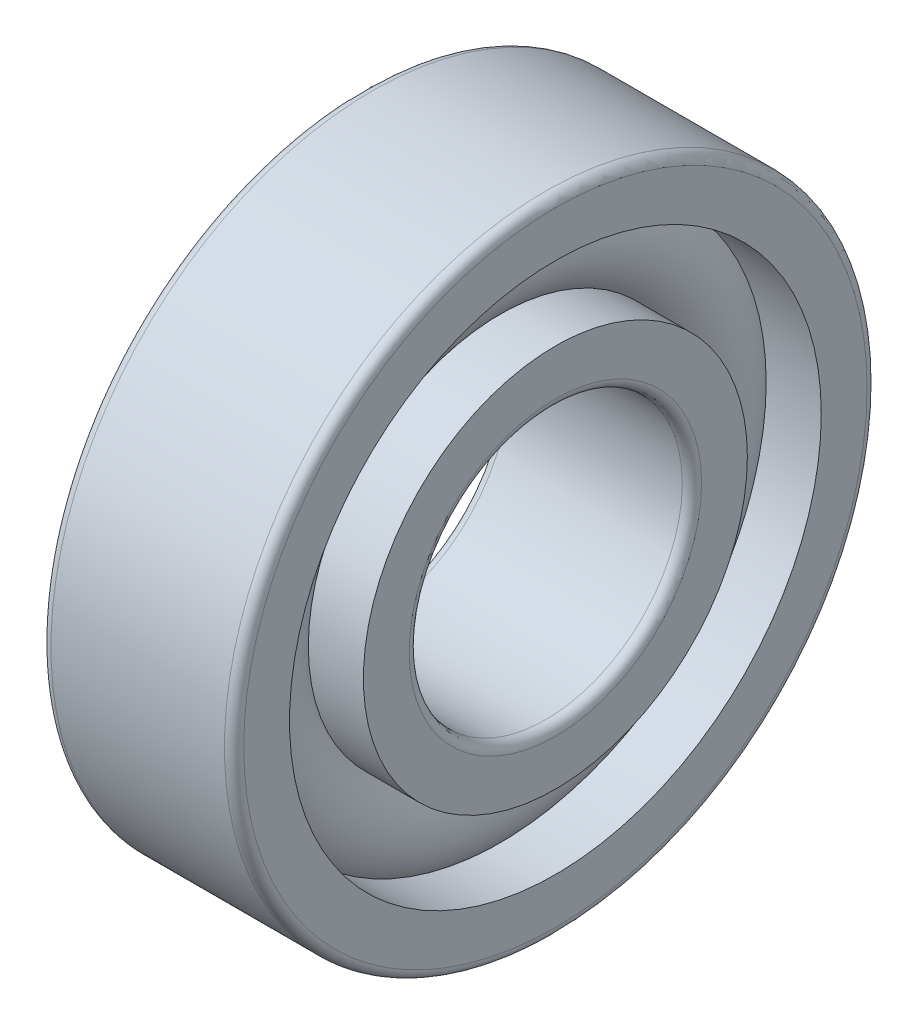
ISO-10303-21;
HEADER;
FILE_DESCRIPTION(('STEP AP214'),'2;1');
FILE_NAME('part.step','',(''),(''),'','','');
FILE_SCHEMA(('AUTOMOTIVE_DESIGN { 1 0 10303 214 1 1 1 1 }'));
ENDSEC;
DATA;
#1=APPLICATION_CONTEXT('core data for automotive mechanical design processes');
#2=APPLICATION_PROTOCOL_DEFINITION('international standard','automotive_design',2000,#1);
#3=PRODUCT_CONTEXT('',#1,'mechanical');
#4=PRODUCT('Part','Part','',(#3));
#5=PRODUCT_RELATED_PRODUCT_CATEGORY('part','',(#4));
#6=PRODUCT_DEFINITION_FORMATION('','',#4);
#7=PRODUCT_DEFINITION_CONTEXT('part definition',#1,'design');
#8=PRODUCT_DEFINITION('design','',#6,#7);
#9=PRODUCT_DEFINITION_SHAPE('','',#8);
#10=(LENGTH_UNIT() NAMED_UNIT(*) SI_UNIT(.MILLI.,.METRE.));
#11=(NAMED_UNIT(*) PLANE_ANGLE_UNIT() SI_UNIT($,.RADIAN.));
#12=(NAMED_UNIT(*) SI_UNIT($,.STERADIAN.) SOLID_ANGLE_UNIT());
#13=UNCERTAINTY_MEASURE_WITH_UNIT(LENGTH_MEASURE(1.E-05),#10,'distance_accuracy_value','');
#14=(GEOMETRIC_REPRESENTATION_CONTEXT(3) GLOBAL_UNCERTAINTY_ASSIGNED_CONTEXT((#13)) GLOBAL_UNIT_ASSIGNED_CONTEXT((#10,
#11,#12)) REPRESENTATION_CONTEXT('',''));
#15=CARTESIAN_POINT('',(0.,0.,0.));
#16=DIRECTION('',(0.,0.,1.));
#17=DIRECTION('',(1.,0.,0.));
#18=AXIS2_PLACEMENT_3D('',#15,#16,#17);
#19=CARTESIAN_POINT('',(0.,0.,0.));
#20=DIRECTION('',(-1.,0.,0.));
#21=DIRECTION('',(0.,0.,1.));
#22=AXIS2_PLACEMENT_3D('',#19,#20,#21);
#23=TOROIDAL_SURFACE('',#22,14.25,3.45);
#24=CARTESIAN_POINT('',(2.57147817412476,0.,0.));
#25=DIRECTION('',(-1.,0.,0.));
#26=DIRECTION('',(0.,0.,1.));
#27=AXIS2_PLACEMENT_3D('',#24,#25,#26);
#28=CIRCLE('',#27,16.55);
#29=CARTESIAN_POINT('',(2.57147817412476,0.,16.55));
#30=VERTEX_POINT('',#29);
#31=EDGE_CURVE('E35',#30,#30,#28,.F.);
#32=ORIENTED_EDGE('',*,*,#31,.T.);
#33=EDGE_LOOP('',(#32));
#34=FACE_BOUND('',#33,.T.);
#35=CARTESIAN_POINT('',(2.57147817412476,0.,0.));
#36=DIRECTION('',(-1.,0.,0.));
#37=DIRECTION('',(0.,0.,1.));
#38=AXIS2_PLACEMENT_3D('',#35,#36,#37);
#39=CIRCLE('',#38,11.95);
#40=CARTESIAN_POINT('',(2.57147817412476,0.,11.95));
#41=VERTEX_POINT('',#40);
#42=EDGE_CURVE('E10',#41,#41,#39,.T.);
#43=ORIENTED_EDGE('',*,*,#42,.T.);
#44=EDGE_LOOP('',(#43));
#45=FACE_BOUND('',#44,.T.);
#46=ADVANCED_FACE('F31',(#34,#45),#23,.T.);
#47=CARTESIAN_POINT('',(-20.6375,0.,0.));
#48=DIRECTION('',(1.,0.,0.));
#49=DIRECTION('',(0.,0.,-1.));
#50=AXIS2_PLACEMENT_3D('',#47,#48,#49);
#51=CYLINDRICAL_SURFACE('',#50,11.95);
#52=CARTESIAN_POINT('',(6.,0.,0.));
#53=DIRECTION('',(1.,0.,0.));
#54=DIRECTION('',(0.,0.,-1.));
#55=AXIS2_PLACEMENT_3D('',#52,#53,#54);
#56=CIRCLE('',#55,11.95);
#57=CARTESIAN_POINT('',(6.,0.,-11.95));
#58=VERTEX_POINT('',#57);
#59=EDGE_CURVE('E44',#58,#58,#56,.T.);
#60=ORIENTED_EDGE('',*,*,#59,.F.);
#61=EDGE_LOOP('',(#60));
#62=FACE_BOUND('',#61,.T.);
#63=ORIENTED_EDGE('',*,*,#42,.F.);
#64=EDGE_LOOP('',(#63));
#65=FACE_BOUND('',#64,.T.);
#66=ADVANCED_FACE('F83',(#62,#65),#51,.T.);
#67=CARTESIAN_POINT('',(-20.6375,0.,0.));
#68=DIRECTION('',(1.,0.,0.));
#69=DIRECTION('',(0.,0.,-1.));
#70=AXIS2_PLACEMENT_3D('',#67,#68,#69);
#71=CYLINDRICAL_SURFACE('',#70,11.95);
#72=CARTESIAN_POINT('',(-6.,0.,0.));
#73=DIRECTION('',(1.,0.,0.));
#74=DIRECTION('',(0.,0.,-1.));
#75=AXIS2_PLACEMENT_3D('',#72,#73,#74);
#76=CIRCLE('',#75,11.95);
#77=CARTESIAN_POINT('',(-6.,0.,-11.95));
#78=VERTEX_POINT('',#77);
#79=EDGE_CURVE('E53',#78,#78,#76,.T.);
#80=ORIENTED_EDGE('',*,*,#79,.T.);
#81=EDGE_LOOP('',(#80));
#82=FACE_BOUND('',#81,.T.);
#83=CARTESIAN_POINT('',(-2.57147817412476,0.,0.));
#84=DIRECTION('',(1.,0.,0.));
#85=DIRECTION('',(0.,0.,-1.));
#86=AXIS2_PLACEMENT_3D('',#83,#84,#85);
#87=CIRCLE('',#86,11.95);
#88=CARTESIAN_POINT('',(-2.57147817412476,0.,-11.95));
#89=VERTEX_POINT('',#88);
#90=EDGE_CURVE('E39',#89,#89,#87,.T.);
#91=ORIENTED_EDGE('',*,*,#90,.F.);
#92=EDGE_LOOP('',(#91));
#93=FACE_BOUND('',#92,.T.);
#94=ADVANCED_FACE('F86',(#82,#93),#71,.T.);
#95=CARTESIAN_POINT('',(6.,9.1,0.));
#96=DIRECTION('',(1.,0.,0.));
#97=DIRECTION('',(0.,0.,-1.));
#98=AXIS2_PLACEMENT_3D('',#95,#96,#97);
#99=PLANE('',#98);
#100=ORIENTED_EDGE('',*,*,#59,.T.);
#101=EDGE_LOOP('',(#100));
#102=FACE_BOUND('',#101,.T.);
#103=CARTESIAN_POINT('',(6.,0.,0.));
#104=DIRECTION('',(1.,0.,0.));
#105=DIRECTION('',(0.,0.,-1.));
#106=AXIS2_PLACEMENT_3D('',#103,#104,#105);
#107=CIRCLE('',#106,9.1);
#108=CARTESIAN_POINT('',(6.,0.,-9.1));
#109=VERTEX_POINT('',#108);
#110=EDGE_CURVE('E75',#109,#109,#107,.T.);
#111=ORIENTED_EDGE('',*,*,#110,.F.);
#112=EDGE_LOOP('',(#111));
#113=FACE_BOUND('',#112,.T.);
#114=ADVANCED_FACE('F80',(#102,#113),#99,.T.);
#115=CARTESIAN_POINT('',(5.4,0.,0.));
#116=DIRECTION('',(1.,0.,0.));
#117=DIRECTION('',(0.,0.,-1.));
#118=AXIS2_PLACEMENT_3D('',#115,#116,#117);
#119=TOROIDAL_SURFACE('',#118,9.1,0.6);
#120=ORIENTED_EDGE('',*,*,#110,.T.);
#121=EDGE_LOOP('',(#120));
#122=FACE_BOUND('',#121,.T.);
#123=CARTESIAN_POINT('',(5.4,0.,0.));
#124=DIRECTION('',(1.,0.,0.));
#125=DIRECTION('',(0.,0.,-1.));
#126=AXIS2_PLACEMENT_3D('',#123,#124,#125);
#127=CIRCLE('',#126,8.5);
#128=CARTESIAN_POINT('',(5.4,0.,-8.5));
#129=VERTEX_POINT('',#128);
#130=EDGE_CURVE('E72',#129,#129,#127,.T.);
#131=ORIENTED_EDGE('',*,*,#130,.F.);
#132=EDGE_LOOP('',(#131));
#133=FACE_BOUND('',#132,.T.);
#134=ADVANCED_FACE('F97',(#122,#133),#119,.T.);
#135=CARTESIAN_POINT('',(-20.6375,0.,0.));
#136=DIRECTION('',(1.,0.,0.));
#137=DIRECTION('',(0.,0.,-1.));
#138=AXIS2_PLACEMENT_3D('',#135,#136,#137);
#139=CYLINDRICAL_SURFACE('',#138,8.5);
#140=ORIENTED_EDGE('',*,*,#130,.T.);
#141=EDGE_LOOP('',(#140));
#142=FACE_BOUND('',#141,.T.);
#143=CARTESIAN_POINT('',(-5.4,0.,0.));
#144=DIRECTION('',(1.,0.,0.));
#145=DIRECTION('',(0.,0.,-1.));
#146=AXIS2_PLACEMENT_3D('',#143,#144,#145);
#147=CIRCLE('',#146,8.5);
#148=CARTESIAN_POINT('',(-5.4,0.,-8.5));
#149=VERTEX_POINT('',#148);
#150=EDGE_CURVE('E69',#149,#149,#147,.T.);
#151=ORIENTED_EDGE('',*,*,#150,.F.);
#152=EDGE_LOOP('',(#151));
#153=FACE_BOUND('',#152,.T.);
#154=ADVANCED_FACE('F100',(#142,#153),#139,.F.);
#155=CARTESIAN_POINT('',(-5.4,0.,0.));
#156=DIRECTION('',(1.,0.,0.));
#157=DIRECTION('',(0.,0.,-1.));
#158=AXIS2_PLACEMENT_3D('',#155,#156,#157);
#159=TOROIDAL_SURFACE('',#158,9.1,0.6);
#160=ORIENTED_EDGE('',*,*,#150,.T.);
#161=EDGE_LOOP('',(#160));
#162=FACE_BOUND('',#161,.T.);
#163=CARTESIAN_POINT('',(-6.,0.,0.));
#164=DIRECTION('',(1.,0.,0.));
#165=DIRECTION('',(0.,0.,-1.));
#166=AXIS2_PLACEMENT_3D('',#163,#164,#165);
#167=CIRCLE('',#166,9.1);
#168=CARTESIAN_POINT('',(-6.,0.,-9.1));
#169=VERTEX_POINT('',#168);
#170=EDGE_CURVE('E66',#169,#169,#167,.T.);
#171=ORIENTED_EDGE('',*,*,#170,.F.);
#172=EDGE_LOOP('',(#171));
#173=FACE_BOUND('',#172,.T.);
#174=ADVANCED_FACE('F104',(#162,#173),#159,.T.);
#175=CARTESIAN_POINT('',(-6.,11.95,0.));
#176=DIRECTION('',(-1.,0.,0.));
#177=DIRECTION('',(0.,0.,1.));
#178=AXIS2_PLACEMENT_3D('',#175,#176,#177);
#179=PLANE('',#178);
#180=ORIENTED_EDGE('',*,*,#170,.T.);
#181=EDGE_LOOP('',(#180));
#182=FACE_BOUND('',#181,.T.);
#183=ORIENTED_EDGE('',*,*,#79,.F.);
#184=EDGE_LOOP('',(#183));
#185=FACE_BOUND('',#184,.T.);
#186=ADVANCED_FACE('F108',(#182,#185),#179,.T.);
#187=CARTESIAN_POINT('',(-2.57147817412476,0.,0.));
#188=DIRECTION('',(1.,0.,0.));
#189=DIRECTION('',(0.,0.,-1.));
#190=AXIS2_PLACEMENT_3D('',#187,#188,#189);
#191=CIRCLE('',#190,16.55);
#192=CARTESIAN_POINT('',(-2.57147817412476,0.,-16.55));
#193=VERTEX_POINT('',#192);
#194=EDGE_CURVE('E47',#193,#193,#191,.F.);
#195=ORIENTED_EDGE('',*,*,#194,.T.);
#196=EDGE_LOOP('',(#195));
#197=FACE_BOUND('',#196,.T.);
#198=ORIENTED_EDGE('',*,*,#90,.T.);
#199=EDGE_LOOP('',(#198));
#200=FACE_BOUND('',#199,.T.);
#201=ADVANCED_FACE('F33',(#197,#200),#23,.T.);
#202=CARTESIAN_POINT('',(-20.6375,0.,0.));
#203=DIRECTION('',(1.,0.,0.));
#204=DIRECTION('',(0.,0.,-1.));
#205=AXIS2_PLACEMENT_3D('',#202,#203,#204);
#206=CYLINDRICAL_SURFACE('',#205,16.55);
#207=CARTESIAN_POINT('',(6.,0.,0.));
#208=DIRECTION('',(1.,0.,0.));
#209=DIRECTION('',(0.,0.,-1.));
#210=AXIS2_PLACEMENT_3D('',#207,#208,#209);
#211=CIRCLE('',#210,16.55);
#212=CARTESIAN_POINT('',(6.,0.,-16.55));
#213=VERTEX_POINT('',#212);
#214=EDGE_CURVE('E49',#213,#213,#211,.T.);
#215=ORIENTED_EDGE('',*,*,#214,.T.);
#216=EDGE_LOOP('',(#215));
#217=FACE_BOUND('',#216,.T.);
#218=ORIENTED_EDGE('',*,*,#31,.F.);
#219=EDGE_LOOP('',(#218));
#220=FACE_BOUND('',#219,.T.);
#221=ADVANCED_FACE('F113',(#217,#220),#206,.F.);
#222=CARTESIAN_POINT('',(-20.6375,0.,0.));
#223=DIRECTION('',(1.,0.,0.));
#224=DIRECTION('',(0.,0.,-1.));
#225=AXIS2_PLACEMENT_3D('',#222,#223,#224);
#226=CYLINDRICAL_SURFACE('',#225,16.55);
#227=CARTESIAN_POINT('',(-6.,0.,0.));
#228=DIRECTION('',(1.,0.,0.));
#229=DIRECTION('',(0.,0.,-1.));
#230=AXIS2_PLACEMENT_3D('',#227,#228,#229);
#231=CIRCLE('',#230,16.55);
#232=CARTESIAN_POINT('',(-6.,0.,-16.55));
#233=VERTEX_POINT('',#232);
#234=EDGE_CURVE('E144',#233,#233,#231,.T.);
#235=ORIENTED_EDGE('',*,*,#234,.F.);
#236=EDGE_LOOP('',(#235));
#237=FACE_BOUND('',#236,.T.);
#238=ORIENTED_EDGE('',*,*,#194,.F.);
#239=EDGE_LOOP('',(#238));
#240=FACE_BOUND('',#239,.T.);
#241=ADVANCED_FACE('F116',(#237,#240),#226,.F.);
#242=CARTESIAN_POINT('',(6.,19.4,0.));
#243=DIRECTION('',(1.,0.,0.));
#244=DIRECTION('',(0.,0.,-1.));
#245=AXIS2_PLACEMENT_3D('',#242,#243,#244);
#246=PLANE('',#245);
#247=CARTESIAN_POINT('',(6.,0.,0.));
#248=DIRECTION('',(1.,0.,0.));
#249=DIRECTION('',(0.,0.,-1.));
#250=AXIS2_PLACEMENT_3D('',#247,#248,#249);
#251=CIRCLE('',#250,19.4);
#252=CARTESIAN_POINT('',(6.,0.,-19.4));
#253=VERTEX_POINT('',#252);
#254=EDGE_CURVE('E55',#253,#253,#251,.T.);
#255=ORIENTED_EDGE('',*,*,#254,.T.);
#256=EDGE_LOOP('',(#255));
#257=FACE_BOUND('',#256,.T.);
#258=ORIENTED_EDGE('',*,*,#214,.F.);
#259=EDGE_LOOP('',(#258));
#260=FACE_BOUND('',#259,.T.);
#261=ADVANCED_FACE('F117',(#257,#260),#246,.T.);
#262=CARTESIAN_POINT('',(5.4,0.,0.));
#263=DIRECTION('',(1.,0.,0.));
#264=DIRECTION('',(0.,0.,-1.));
#265=AXIS2_PLACEMENT_3D('',#262,#263,#264);
#266=TOROIDAL_SURFACE('',#265,19.4,0.6);
#267=CARTESIAN_POINT('',(5.4,0.,0.));
#268=DIRECTION('',(1.,0.,0.));
#269=DIRECTION('',(0.,0.,-1.));
#270=AXIS2_PLACEMENT_3D('',#267,#268,#269);
#271=CIRCLE('',#270,20.);
#272=CARTESIAN_POINT('',(5.4,0.,-20.));
#273=VERTEX_POINT('',#272);
#274=EDGE_CURVE('E60',#273,#273,#271,.T.);
#275=ORIENTED_EDGE('',*,*,#274,.T.);
#276=EDGE_LOOP('',(#275));
#277=FACE_BOUND('',#276,.T.);
#278=ORIENTED_EDGE('',*,*,#254,.F.);
#279=EDGE_LOOP('',(#278));
#280=FACE_BOUND('',#279,.T.);
#281=ADVANCED_FACE('F120',(#277,#280),#266,.T.);
#282=CARTESIAN_POINT('',(-20.6375,0.,0.));
#283=DIRECTION('',(1.,0.,0.));
#284=DIRECTION('',(0.,0.,-1.));
#285=AXIS2_PLACEMENT_3D('',#282,#283,#284);
#286=CYLINDRICAL_SURFACE('',#285,20.);
#287=CARTESIAN_POINT('',(-5.4,0.,0.));
#288=DIRECTION('',(1.,0.,0.));
#289=DIRECTION('',(0.,0.,-1.));
#290=AXIS2_PLACEMENT_3D('',#287,#288,#289);
#291=CIRCLE('',#290,20.);
#292=CARTESIAN_POINT('',(-5.4,0.,-20.));
#293=VERTEX_POINT('',#292);
#294=EDGE_CURVE('E148',#293,#293,#291,.T.);
#295=ORIENTED_EDGE('',*,*,#294,.T.);
#296=EDGE_LOOP('',(#295));
#297=FACE_BOUND('',#296,.T.);
#298=ORIENTED_EDGE('',*,*,#274,.F.);
#299=EDGE_LOOP('',(#298));
#300=FACE_BOUND('',#299,.T.);
#301=ADVANCED_FACE('F124',(#297,#300),#286,.T.);
#302=CARTESIAN_POINT('',(-5.4,0.,0.));
#303=DIRECTION('',(1.,0.,0.));
#304=DIRECTION('',(0.,0.,-1.));
#305=AXIS2_PLACEMENT_3D('',#302,#303,#304);
#306=TOROIDAL_SURFACE('',#305,19.4,0.6);
#307=CARTESIAN_POINT('',(-6.,0.,0.));
#308=DIRECTION('',(1.,0.,0.));
#309=DIRECTION('',(0.,0.,-1.));
#310=AXIS2_PLACEMENT_3D('',#307,#308,#309);
#311=CIRCLE('',#310,19.4);
#312=CARTESIAN_POINT('',(-6.,0.,-19.4));
#313=VERTEX_POINT('',#312);
#314=EDGE_CURVE('E145',#313,#313,#311,.T.);
#315=ORIENTED_EDGE('',*,*,#314,.T.);
#316=EDGE_LOOP('',(#315));
#317=FACE_BOUND('',#316,.T.);
#318=ORIENTED_EDGE('',*,*,#294,.F.);
#319=EDGE_LOOP('',(#318));
#320=FACE_BOUND('',#319,.T.);
#321=ADVANCED_FACE('F128',(#317,#320),#306,.T.);
#322=CARTESIAN_POINT('',(-6.,16.55,0.));
#323=DIRECTION('',(-1.,0.,0.));
#324=DIRECTION('',(0.,0.,1.));
#325=AXIS2_PLACEMENT_3D('',#322,#323,#324);
#326=PLANE('',#325);
#327=ORIENTED_EDGE('',*,*,#234,.T.);
#328=EDGE_LOOP('',(#327));
#329=FACE_BOUND('',#328,.T.);
#330=ORIENTED_EDGE('',*,*,#314,.F.);
#331=EDGE_LOOP('',(#330));
#332=FACE_BOUND('',#331,.T.);
#333=ADVANCED_FACE('F132',(#329,#332),#326,.T.);
#334=CLOSED_SHELL('',(#46,#66,#94,#114,#134,#154,#174,#186,#201,#221,#241,#261,#281,#301,#321,#333));
#335=MANIFOLD_SOLID_BREP('B2',#334);
#336=ADVANCED_BREP_SHAPE_REPRESENTATION('',(#18,#335),#14);
#337=SHAPE_DEFINITION_REPRESENTATION(#9,#336);
ENDSEC;
END-ISO-10303-21;
